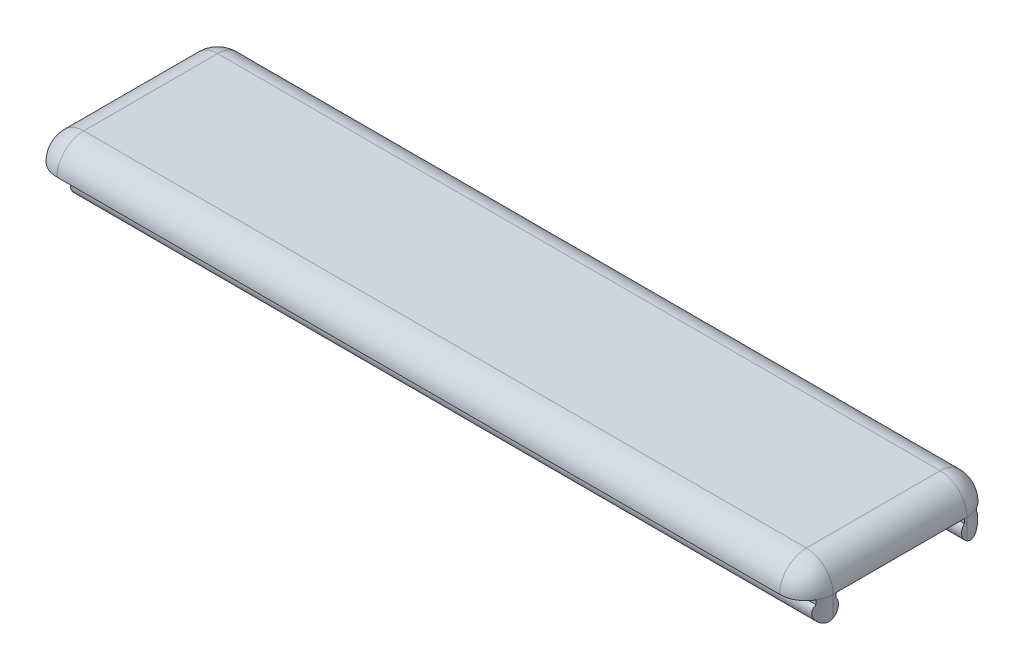
ISO-10303-21;
HEADER;
FILE_DESCRIPTION(('STEP AP214'),'2;1');
FILE_NAME('part.step','',(''),(''),'','','');
FILE_SCHEMA(('AUTOMOTIVE_DESIGN { 1 0 10303 214 1 1 1 1 }'));
ENDSEC;
DATA;
#1=APPLICATION_CONTEXT('core data for automotive mechanical design processes');
#2=APPLICATION_PROTOCOL_DEFINITION('international standard','automotive_design',2000,#1);
#3=PRODUCT_CONTEXT('',#1,'mechanical');
#4=PRODUCT('Part','Part','',(#3));
#5=PRODUCT_RELATED_PRODUCT_CATEGORY('part','',(#4));
#6=PRODUCT_DEFINITION_FORMATION('','',#4);
#7=PRODUCT_DEFINITION_CONTEXT('part definition',#1,'design');
#8=PRODUCT_DEFINITION('design','',#6,#7);
#9=PRODUCT_DEFINITION_SHAPE('','',#8);
#10=(LENGTH_UNIT() NAMED_UNIT(*) SI_UNIT(.MILLI.,.METRE.));
#11=(NAMED_UNIT(*) PLANE_ANGLE_UNIT() SI_UNIT($,.RADIAN.));
#12=(NAMED_UNIT(*) SI_UNIT($,.STERADIAN.) SOLID_ANGLE_UNIT());
#13=UNCERTAINTY_MEASURE_WITH_UNIT(LENGTH_MEASURE(1.E-05),#10,'distance_accuracy_value','');
#14=(GEOMETRIC_REPRESENTATION_CONTEXT(3) GLOBAL_UNCERTAINTY_ASSIGNED_CONTEXT((#13)) GLOBAL_UNIT_ASSIGNED_CONTEXT((#10,
#11,#12)) REPRESENTATION_CONTEXT('',''));
#15=CARTESIAN_POINT('',(0.,0.,0.));
#16=DIRECTION('',(0.,0.,1.));
#17=DIRECTION('',(1.,0.,0.));
#18=AXIS2_PLACEMENT_3D('',#15,#16,#17);
#19=CARTESIAN_POINT('',(72.5,-2.1,12.));
#20=DIRECTION('',(-1.,0.,0.));
#21=DIRECTION('',(0.,0.,1.));
#22=AXIS2_PLACEMENT_3D('',#19,#20,#21);
#23=PLANE('',#22);
#24=DIRECTION('',(0.,1.,0.));
#25=VECTOR('',#24,1.);
#26=CARTESIAN_POINT('',(72.5,-4.1,12.5));
#27=LINE('',#26,#25);
#28=CARTESIAN_POINT('',(72.5,-3.83205080756888,12.5));
#29=VERTEX_POINT('',#28);
#30=CARTESIAN_POINT('',(72.5,0.,12.5));
#31=VERTEX_POINT('',#30);
#32=EDGE_CURVE('E266',#29,#31,#27,.T.);
#33=ORIENTED_EDGE('',*,*,#32,.F.);
#34=CARTESIAN_POINT('',(72.5,-2.1,13.5));
#35=DIRECTION('',(1.,0.,0.));
#36=DIRECTION('',(0.,0.,-1.));
#37=AXIS2_PLACEMENT_3D('',#34,#35,#36);
#38=CIRCLE('',#37,2.);
#39=CARTESIAN_POINT('',(72.5,-0.777124344467708,12.));
#40=VERTEX_POINT('',#39);
#41=EDGE_CURVE('E288',#29,#40,#38,.T.);
#42=ORIENTED_EDGE('',*,*,#41,.T.);
#43=DIRECTION('',(0.,1.,0.));
#44=VECTOR('',#43,1.);
#45=CARTESIAN_POINT('',(72.5,-2.1,12.));
#46=LINE('',#45,#44);
#47=CARTESIAN_POINT('',(72.5,0.,12.));
#48=VERTEX_POINT('',#47);
#49=EDGE_CURVE('E325',#40,#48,#46,.T.);
#50=ORIENTED_EDGE('',*,*,#49,.T.);
#51=DIRECTION('',(0.,0.,-1.));
#52=VECTOR('',#51,1.);
#53=CARTESIAN_POINT('',(72.5,0.,17.5));
#54=LINE('',#53,#52);
#55=EDGE_CURVE('E332',#31,#48,#54,.T.);
#56=ORIENTED_EDGE('',*,*,#55,.F.);
#57=EDGE_LOOP('',(#33,#42,#50,#56));
#58=FACE_BOUND('',#57,.T.);
#59=ADVANCED_FACE('F42',(#58),#23,.F.);
#60=CARTESIAN_POINT('',(72.5,-2.1,15.));
#61=DIRECTION('',(0.,0.,-1.));
#62=DIRECTION('',(-1.,0.,0.));
#63=AXIS2_PLACEMENT_3D('',#60,#61,#62);
#64=PLANE('',#63);
#65=DIRECTION('',(0.,1.,0.));
#66=VECTOR('',#65,1.);
#67=CARTESIAN_POINT('',(71.8301270189222,-4.1,15.));
#68=LINE('',#67,#66);
#69=CARTESIAN_POINT('',(71.8301270189222,0.,15.));
#70=VERTEX_POINT('',#69);
#71=CARTESIAN_POINT('',(71.8301270189222,-0.777124344467697,15.));
#72=VERTEX_POINT('',#71);
#73=EDGE_CURVE('E273',#70,#72,#68,.F.);
#74=ORIENTED_EDGE('',*,*,#73,.F.);
#75=DIRECTION('',(-1.,0.,0.));
#76=VECTOR('',#75,1.);
#77=CARTESIAN_POINT('',(72.5,0.,15.));
#78=LINE('',#77,#76);
#79=CARTESIAN_POINT('',(-67.,0.,15.));
#80=VERTEX_POINT('',#79);
#81=EDGE_CURVE('E315',#70,#80,#78,.T.);
#82=ORIENTED_EDGE('',*,*,#81,.T.);
#83=DIRECTION('',(0.,1.,0.));
#84=VECTOR('',#83,1.);
#85=CARTESIAN_POINT('',(-67.,-2.1,15.));
#86=LINE('',#85,#84);
#87=CARTESIAN_POINT('',(-67.,-0.777124344467697,15.));
#88=VERTEX_POINT('',#87);
#89=EDGE_CURVE('E329',#88,#80,#86,.T.);
#90=ORIENTED_EDGE('',*,*,#89,.F.);
#91=DIRECTION('',(1.,0.,0.));
#92=VECTOR('',#91,1.);
#93=CARTESIAN_POINT('',(-72.6568542494924,-0.777124344467697,15.));
#94=LINE('',#93,#92);
#95=EDGE_CURVE('E293',#88,#72,#94,.T.);
#96=ORIENTED_EDGE('',*,*,#95,.T.);
#97=EDGE_LOOP('',(#74,#82,#90,#96));
#98=FACE_BOUND('',#97,.T.);
#99=ADVANCED_FACE('F447',(#98),#64,.F.);
#100=CARTESIAN_POINT('',(-72.6568542494924,-2.1,13.5));
#101=DIRECTION('',(1.,0.,0.));
#102=DIRECTION('',(0.,0.,-1.));
#103=AXIS2_PLACEMENT_3D('',#100,#101,#102);
#104=CYLINDRICAL_SURFACE('',#103,2.);
#105=ORIENTED_EDGE('',*,*,#41,.F.);
#106=CARTESIAN_POINT('',(72.5,-3.83205080756888,12.5));
#107=CARTESIAN_POINT('',(72.5000051497267,-3.8586377823377,12.5460365078236));
#108=CARTESIAN_POINT('',(72.4993643157109,-3.88337810402291,12.59314069797));
#109=CARTESIAN_POINT('',(72.4966509029909,-3.92902058815213,12.6891353171411));
#110=CARTESIAN_POINT('',(72.4945782697301,-3.94992260430444,12.7380258141632));
#111=CARTESIAN_POINT('',(72.4888670093177,-3.98770486241585,12.8371440450599));
#112=CARTESIAN_POINT('',(72.4852314304111,-4.00459283399911,12.8873689983466));
#113=CARTESIAN_POINT('',(72.4763069192016,-4.03430134702921,12.9888465621957));
#114=CARTESIAN_POINT('',(72.4710180795205,-4.04712211625498,13.0400991150375));
#115=CARTESIAN_POINT('',(72.4525581692937,-4.0793981669255,13.1949242412481));
#116=CARTESIAN_POINT('',(72.436793915347,-4.09266572632393,13.2995604139902));
#117=CARTESIAN_POINT('',(72.3984353701033,-4.10271565022982,13.508273897506));
#118=CARTESIAN_POINT('',(72.3758416716876,-4.0994994453478,13.6123512559939));
#119=CARTESIAN_POINT('',(72.3242896848976,-4.07726417748559,13.818173896726));
#120=CARTESIAN_POINT('',(72.2952758201275,-4.05810281846783,13.9198896716079));
#121=CARTESIAN_POINT('',(72.2322037555696,-4.00497180398602,14.1177299482178));
#122=CARTESIAN_POINT('',(72.1981430907153,-3.97099489614719,14.2138516854497));
#123=CARTESIAN_POINT('',(72.1234426411648,-3.88605501582515,14.4066607553379));
#124=CARTESIAN_POINT('',(72.0824894357773,-3.83388961756837,14.5026959043862));
#125=CARTESIAN_POINT('',(71.9986519075302,-3.71514562217958,14.6845313329512));
#126=CARTESIAN_POINT('',(71.9557659765214,-3.64855484008303,14.7703228641782));
#127=CARTESIAN_POINT('',(71.8664305182792,-3.49503878727911,14.9380660052748));
#128=CARTESIAN_POINT('',(71.8200432291564,-3.40676088603826,15.0188190933193));
#129=CARTESIAN_POINT('',(71.7319440814113,-3.21573705486275,15.1641832270633));
#130=CARTESIAN_POINT('',(71.6902282998661,-3.11300343031669,15.228807873603));
#131=CARTESIAN_POINT('',(71.6241294877134,-2.91837578204629,15.3274184972095));
#132=CARTESIAN_POINT('',(71.597948594273,-2.82891956043812,15.3650061522905));
#133=CARTESIAN_POINT('',(71.5537936372805,-2.6436899489622,15.4271522161069));
#134=CARTESIAN_POINT('',(71.5358098971438,-2.54792416114056,15.4517259930578));
#135=CARTESIAN_POINT('',(71.5100775529531,-2.3517915082896,15.4865982987532));
#136=CARTESIAN_POINT('',(71.5023940258154,-2.25139949578742,15.4968060829075));
#137=CARTESIAN_POINT('',(71.4985701409913,-2.05001313679733,15.5019081458503));
#138=CARTESIAN_POINT('',(71.5024264691326,-1.94901897155801,15.4968068213153));
#139=CARTESIAN_POINT('',(71.5201752285011,-1.75985096216501,15.4729393311563));
#140=CARTESIAN_POINT('',(71.5330407101488,-1.6713948290502,15.4555699761503));
#141=CARTESIAN_POINT('',(71.5663112117035,-1.49890773185101,15.4096238344383));
#142=CARTESIAN_POINT('',(71.5867217598434,-1.41488006418928,15.3810388291358));
#143=CARTESIAN_POINT('',(71.635114913323,-1.24644143536097,15.311184883511));
#144=CARTESIAN_POINT('',(71.6635614043424,-1.16250443480382,15.2691052968919));
#145=CARTESIAN_POINT('',(71.7248810512641,-1.0025933857869,15.1746097210026));
#146=CARTESIAN_POINT('',(71.7577498350435,-0.926611602640642,15.1222039173272));
#147=CARTESIAN_POINT('',(71.8044433102529,-0.828409103959493,15.0440875491672));
#148=CARTESIAN_POINT('',(71.8172284161431,-0.802460594960075,15.022344328525));
#149=CARTESIAN_POINT('',(71.8301270189222,-0.777124344467696,15.));
#150=B_SPLINE_CURVE_WITH_KNOTS('',3,(#106,#107,#108,#109,#110,#111,#112,#113,#114,#115,#116,
#117,#118,#119,#120,#121,#122,#123,#124,#125,#126,#127,#128,#129,#130,#131,#132,#133,#134,#135,
#136,#137,#138,#139,#140,#141,#142,#143,#144,#145,#146,#147,#148,#149),.UNSPECIFIED.,.F.,.F.,(4,
2,2,2,2,2,2,2,2,2,2,2,2,2,2,2,2,2,2,2,2,4),(0.,0.159441493493553,0.318889062618392,
0.478027058700238,0.637156140869807,0.955426570056517,1.27366937731754,1.59478305667,
1.91605410148729,2.26475063051828,2.61374285625625,2.99690704003933,3.37974700782848,
3.68005336106362,3.9800042843142,4.28184150892179,4.58359205613913,4.85559282929881,
5.12779329236686,5.42106720097359,5.71405326465856,5.8225663026188),.UNSPECIFIED.);
#151=EDGE_CURVE('E11',#29,#72,#150,.T.);
#152=ORIENTED_EDGE('',*,*,#151,.T.);
#153=ORIENTED_EDGE('',*,*,#95,.F.);
#154=CARTESIAN_POINT('',(-67.,-2.1,13.5));
#155=DIRECTION('',(1.,0.,0.));
#156=DIRECTION('',(0.,0.,-1.));
#157=AXIS2_PLACEMENT_3D('',#154,#155,#156);
#158=CIRCLE('',#157,2.);
#159=CARTESIAN_POINT('',(-67.,-0.777124344467708,12.));
#160=VERTEX_POINT('',#159);
#161=EDGE_CURVE('E290',#160,#88,#158,.F.);
#162=ORIENTED_EDGE('',*,*,#161,.F.);
#163=DIRECTION('',(1.,0.,0.));
#164=VECTOR('',#163,1.);
#165=CARTESIAN_POINT('',(-72.6568542494924,-0.777124344467708,12.));
#166=LINE('',#165,#164);
#167=EDGE_CURVE('E318',#40,#160,#166,.F.);
#168=ORIENTED_EDGE('',*,*,#167,.F.);
#169=EDGE_LOOP('',(#105,#152,#153,#162,#168));
#170=FACE_BOUND('',#169,.T.);
#171=ADVANCED_FACE('F453',(#170),#104,.T.);
#172=CARTESIAN_POINT('',(72.5,-2.1,-15.));
#173=DIRECTION('',(0.,0.,1.));
#174=DIRECTION('',(1.,0.,0.));
#175=AXIS2_PLACEMENT_3D('',#172,#173,#174);
#176=PLANE('',#175);
#177=DIRECTION('',(0.,1.,0.));
#178=VECTOR('',#177,1.);
#179=CARTESIAN_POINT('',(71.8301270189222,-4.1,-15.));
#180=LINE('',#179,#178);
#181=CARTESIAN_POINT('',(71.8301270189222,-0.777124344467713,-15.));
#182=VERTEX_POINT('',#181);
#183=CARTESIAN_POINT('',(71.8301270189222,0.,-15.));
#184=VERTEX_POINT('',#183);
#185=EDGE_CURVE('E278',#182,#184,#180,.T.);
#186=ORIENTED_EDGE('',*,*,#185,.F.);
#187=DIRECTION('',(1.,0.,0.));
#188=VECTOR('',#187,1.);
#189=CARTESIAN_POINT('',(-72.6568542494924,-0.777124344467713,-15.));
#190=LINE('',#189,#188);
#191=CARTESIAN_POINT('',(-67.,-0.777124344467713,-15.));
#192=VERTEX_POINT('',#191);
#193=EDGE_CURVE('E388',#182,#192,#190,.F.);
#194=ORIENTED_EDGE('',*,*,#193,.T.);
#195=DIRECTION('',(0.,1.,0.));
#196=VECTOR('',#195,1.);
#197=CARTESIAN_POINT('',(-67.,-2.1,-15.));
#198=LINE('',#197,#196);
#199=CARTESIAN_POINT('',(-67.,0.,-15.));
#200=VERTEX_POINT('',#199);
#201=EDGE_CURVE('E308',#192,#200,#198,.T.);
#202=ORIENTED_EDGE('',*,*,#201,.T.);
#203=DIRECTION('',(1.,0.,0.));
#204=VECTOR('',#203,1.);
#205=CARTESIAN_POINT('',(72.5,0.,-15.));
#206=LINE('',#205,#204);
#207=EDGE_CURVE('E305',#200,#184,#206,.T.);
#208=ORIENTED_EDGE('',*,*,#207,.T.);
#209=EDGE_LOOP('',(#186,#194,#202,#208));
#210=FACE_BOUND('',#209,.T.);
#211=ADVANCED_FACE('F503',(#210),#176,.F.);
#212=CARTESIAN_POINT('',(-72.6568542494924,-2.1,-13.5));
#213=DIRECTION('',(1.,0.,0.));
#214=DIRECTION('',(0.,0.,-1.));
#215=AXIS2_PLACEMENT_3D('',#212,#213,#214);
#216=CYLINDRICAL_SURFACE('',#215,2.);
#217=ORIENTED_EDGE('',*,*,#193,.F.);
#218=CARTESIAN_POINT('',(71.8301270189222,-0.777124344467713,-15.));
#219=CARTESIAN_POINT('',(71.7903887656085,-0.855232548240955,-15.0688885369105));
#220=CARTESIAN_POINT('',(71.7516615980636,-0.93922114525095,-15.132099022754));
#221=CARTESIAN_POINT('',(71.679092052389,-1.11848426219626,-15.2458552449527));
#222=CARTESIAN_POINT('',(71.6452992512872,-1.21385786003245,-15.2962757598494));
#223=CARTESIAN_POINT('',(71.5861729997275,-1.41443748585583,-15.382004350938));
#224=CARTESIAN_POINT('',(71.5608867014549,-1.51969431256576,-15.4172284868965));
#225=CARTESIAN_POINT('',(71.522616060364,-1.73632978955962,-15.4697896679562));
#226=CARTESIAN_POINT('',(71.5095742618047,-1.84767722710235,-15.4872102882304));
#227=CARTESIAN_POINT('',(71.498556921324,-2.05744246969237,-15.5019332580329));
#228=CARTESIAN_POINT('',(71.4988046186273,-2.15560503283809,-15.5016080510088));
#229=CARTESIAN_POINT('',(71.5099676363751,-2.35029737908092,-15.4866777607306));
#230=CARTESIAN_POINT('',(71.5208926784616,-2.44682559262955,-15.4720596639026));
#231=CARTESIAN_POINT('',(71.5509588421055,-2.62882102202493,-15.4309242518983));
#232=CARTESIAN_POINT('',(71.5694908138221,-2.71459405223836,-15.4052835903944));
#233=CARTESIAN_POINT('',(71.612875839932,-2.88053488975168,-15.3435315873049));
#234=CARTESIAN_POINT('',(71.6377295659807,-2.96070210030612,-15.3074191330856));
#235=CARTESIAN_POINT('',(71.6956562481701,-3.12502084936273,-15.220213604462));
#236=CARTESIAN_POINT('',(71.7293893744356,-3.20820565631949,-15.1677437493387));
#237=CARTESIAN_POINT('',(71.8001864095033,-3.36516170014842,-15.0520586373715));
#238=CARTESIAN_POINT('',(71.8372527752876,-3.43892589439437,-14.9888354229514));
#239=CARTESIAN_POINT('',(71.919337897746,-3.58866353817369,-14.8404823894347));
#240=CARTESIAN_POINT('',(71.9645871690909,-3.66264484983667,-14.7534578081731));
#241=CARTESIAN_POINT('',(72.0536557986934,-3.79508798452008,-14.5675714434908));
#242=CARTESIAN_POINT('',(72.0974742618177,-3.85354024954858,-14.4687024239829));
#243=CARTESIAN_POINT('',(72.1831645748203,-3.95576974323272,-14.2555121906804));
#244=CARTESIAN_POINT('',(72.2248163791233,-3.99862474128537,-14.1406545374361));
#245=CARTESIAN_POINT('',(72.3007937451913,-4.06287185420124,-13.9028223970878));
#246=CARTESIAN_POINT('',(72.3351266985739,-4.08428570499448,-13.7798562650453));
#247=CARTESIAN_POINT('',(72.3918419924295,-4.1028431829185,-13.5409639055485));
#248=CARTESIAN_POINT('',(72.4150138994325,-4.10196994253518,-13.4253798620884));
#249=CARTESIAN_POINT('',(72.4528752812184,-4.07994984528907,-13.1947322168079));
#250=CARTESIAN_POINT('',(72.4675692747094,-4.05881380447121,-13.0796683702332));
#251=CARTESIAN_POINT('',(72.4857753929797,-4.00519098653087,-12.8856790770473));
#252=CARTESIAN_POINT('',(72.4912581481445,-3.97747548731091,-12.805578469221));
#253=CARTESIAN_POINT('',(72.4983853831719,-3.91209967409706,-12.6494182651707));
#254=CARTESIAN_POINT('',(72.500032139118,-3.87444527210937,-12.5733562988226));
#255=CARTESIAN_POINT('',(72.5,-3.83205080756888,-12.5));
#256=B_SPLINE_CURVE_WITH_KNOTS('',3,(#218,#219,#220,#221,#222,#223,#224,#225,#226,#227,#228,
#229,#230,#231,#232,#233,#234,#235,#236,#237,#238,#239,#240,#241,#242,#243,#244,#245,#246,#247,
#248,#249,#250,#251,#252,#253,#254,#255),.UNSPECIFIED.,.F.,.F.,(4,2,2,2,2,2,2,2,2,2,2,2,2,2,2,2,
2,2,4),(0.,0.334507423064719,0.672173400216167,1.01168137794935,1.34958817687069,
1.64244712879718,1.93557297524073,2.20876810587288,2.4819922742829,2.79276835309208,
3.10377541743615,3.47076175958286,3.83797345803227,4.22429916105857,4.61023282927275,
4.96195602614956,5.31349158178893,5.56756984235079,5.8214973075652),.UNSPECIFIED.);
#257=CARTESIAN_POINT('',(72.5,-3.83205080756888,-12.5));
#258=VERTEX_POINT('',#257);
#259=EDGE_CURVE('E56',#182,#258,#256,.T.);
#260=ORIENTED_EDGE('',*,*,#259,.T.);
#261=CARTESIAN_POINT('',(72.5,-2.1,-13.5));
#262=DIRECTION('',(1.,0.,0.));
#263=DIRECTION('',(0.,0.,-1.));
#264=AXIS2_PLACEMENT_3D('',#261,#262,#263);
#265=CIRCLE('',#264,2.);
#266=CARTESIAN_POINT('',(72.5,-0.777124344467706,-12.));
#267=VERTEX_POINT('',#266);
#268=EDGE_CURVE('E280',#267,#258,#265,.T.);
#269=ORIENTED_EDGE('',*,*,#268,.F.);
#270=DIRECTION('',(1.,0.,0.));
#271=VECTOR('',#270,1.);
#272=CARTESIAN_POINT('',(-72.6568542494924,-0.777124344467706,-12.));
#273=LINE('',#272,#271);
#274=CARTESIAN_POINT('',(-67.,-0.777124344467706,-12.));
#275=VERTEX_POINT('',#274);
#276=EDGE_CURVE('E286',#275,#267,#273,.T.);
#277=ORIENTED_EDGE('',*,*,#276,.F.);
#278=CARTESIAN_POINT('',(-67.,-2.1,-13.5));
#279=DIRECTION('',(1.,0.,0.));
#280=DIRECTION('',(0.,0.,-1.));
#281=AXIS2_PLACEMENT_3D('',#278,#279,#280);
#282=CIRCLE('',#281,2.);
#283=EDGE_CURVE('E283',#192,#275,#282,.F.);
#284=ORIENTED_EDGE('',*,*,#283,.F.);
#285=EDGE_LOOP('',(#217,#260,#269,#277,#284));
#286=FACE_BOUND('',#285,.T.);
#287=ADVANCED_FACE('F396',(#286),#216,.T.);
#288=CARTESIAN_POINT('',(0.,0.,0.));
#289=DIRECTION('',(0.,-1.,0.));
#290=DIRECTION('',(0.,0.,-1.));
#291=AXIS2_PLACEMENT_3D('',#288,#289,#290);
#292=PLANE('',#291);
#293=DIRECTION('',(0.,0.,-1.));
#294=VECTOR('',#293,1.);
#295=CARTESIAN_POINT('',(60.5,0.,7.5));
#296=LINE('',#295,#294);
#297=CARTESIAN_POINT('',(60.5,0.,7.5));
#298=VERTEX_POINT('',#297);
#299=CARTESIAN_POINT('',(60.5,0.,-7.5));
#300=VERTEX_POINT('',#299);
#301=EDGE_CURVE('E63',#298,#300,#296,.T.);
#302=ORIENTED_EDGE('',*,*,#301,.F.);
#303=DIRECTION('',(-1.,0.,0.));
#304=VECTOR('',#303,1.);
#305=CARTESIAN_POINT('',(60.5,0.,7.5));
#306=LINE('',#305,#304);
#307=CARTESIAN_POINT('',(62.5,0.,7.5));
#308=VERTEX_POINT('',#307);
#309=EDGE_CURVE('E223',#308,#298,#306,.T.);
#310=ORIENTED_EDGE('',*,*,#309,.F.);
#311=DIRECTION('',(0.,0.,1.));
#312=VECTOR('',#311,1.);
#313=CARTESIAN_POINT('',(62.5,0.,7.5));
#314=LINE('',#313,#312);
#315=CARTESIAN_POINT('',(62.5,0.,-7.5));
#316=VERTEX_POINT('',#315);
#317=EDGE_CURVE('E226',#316,#308,#314,.T.);
#318=ORIENTED_EDGE('',*,*,#317,.F.);
#319=DIRECTION('',(1.,0.,0.));
#320=VECTOR('',#319,1.);
#321=CARTESIAN_POINT('',(60.5,0.,-7.5));
#322=LINE('',#321,#320);
#323=EDGE_CURVE('E232',#300,#316,#322,.T.);
#324=ORIENTED_EDGE('',*,*,#323,.F.);
#325=EDGE_LOOP('',(#302,#310,#318,#324));
#326=FACE_BOUND('',#325,.T.);
#327=DIRECTION('',(0.,0.,-1.));
#328=VECTOR('',#327,1.);
#329=CARTESIAN_POINT('',(-67.5,0.,7.5));
#330=LINE('',#329,#328);
#331=CARTESIAN_POINT('',(-67.5,0.,7.5));
#332=VERTEX_POINT('',#331);
#333=CARTESIAN_POINT('',(-67.5,0.,-7.5));
#334=VERTEX_POINT('',#333);
#335=EDGE_CURVE('E71',#332,#334,#330,.T.);
#336=ORIENTED_EDGE('',*,*,#335,.F.);
#337=DIRECTION('',(-1.,0.,0.));
#338=VECTOR('',#337,1.);
#339=CARTESIAN_POINT('',(-67.5,0.,7.5));
#340=LINE('',#339,#338);
#341=CARTESIAN_POINT('',(-65.5,0.,7.5));
#342=VERTEX_POINT('',#341);
#343=EDGE_CURVE('E245',#342,#332,#340,.T.);
#344=ORIENTED_EDGE('',*,*,#343,.F.);
#345=DIRECTION('',(0.,0.,1.));
#346=VECTOR('',#345,1.);
#347=CARTESIAN_POINT('',(-65.5,0.,7.5));
#348=LINE('',#347,#346);
#349=CARTESIAN_POINT('',(-65.5,0.,-7.5));
#350=VERTEX_POINT('',#349);
#351=EDGE_CURVE('E259',#350,#342,#348,.T.);
#352=ORIENTED_EDGE('',*,*,#351,.F.);
#353=DIRECTION('',(1.,0.,0.));
#354=VECTOR('',#353,1.);
#355=CARTESIAN_POINT('',(-67.5,0.,-7.5));
#356=LINE('',#355,#354);
#357=EDGE_CURVE('E256',#334,#350,#356,.T.);
#358=ORIENTED_EDGE('',*,*,#357,.F.);
#359=EDGE_LOOP('',(#336,#344,#352,#358));
#360=FACE_BOUND('',#359,.T.);
#361=DIRECTION('',(0.,0.,-1.));
#362=VECTOR('',#361,1.);
#363=CARTESIAN_POINT('',(-67.,0.,-12.));
#364=LINE('',#363,#362);
#365=CARTESIAN_POINT('',(-67.,0.,-12.));
#366=VERTEX_POINT('',#365);
#367=EDGE_CURVE('E302',#366,#200,#364,.T.);
#368=ORIENTED_EDGE('',*,*,#367,.F.);
#369=DIRECTION('',(-1.,0.,0.));
#370=VECTOR('',#369,1.);
#371=CARTESIAN_POINT('',(72.5,0.,-12.));
#372=LINE('',#371,#370);
#373=CARTESIAN_POINT('',(72.5,0.,-12.));
#374=VERTEX_POINT('',#373);
#375=EDGE_CURVE('E299',#374,#366,#372,.T.);
#376=ORIENTED_EDGE('',*,*,#375,.F.);
#377=EDGE_CURVE('E331',#48,#374,#54,.T.);
#378=ORIENTED_EDGE('',*,*,#377,.F.);
#379=DIRECTION('',(1.,0.,0.));
#380=VECTOR('',#379,1.);
#381=CARTESIAN_POINT('',(72.5,0.,12.));
#382=LINE('',#381,#380);
#383=CARTESIAN_POINT('',(-67.,0.,12.));
#384=VERTEX_POINT('',#383);
#385=EDGE_CURVE('E322',#384,#48,#382,.T.);
#386=ORIENTED_EDGE('',*,*,#385,.F.);
#387=DIRECTION('',(0.,0.,-1.));
#388=VECTOR('',#387,1.);
#389=CARTESIAN_POINT('',(-67.,0.,12.));
#390=LINE('',#389,#388);
#391=EDGE_CURVE('E314',#80,#384,#390,.T.);
#392=ORIENTED_EDGE('',*,*,#391,.F.);
#393=ORIENTED_EDGE('',*,*,#81,.F.);
#394=CARTESIAN_POINT('',(67.5,0.,12.5));
#395=DIRECTION('',(0.,-1.,0.));
#396=DIRECTION('',(0.,0.,-1.));
#397=AXIS2_PLACEMENT_3D('',#394,#395,#396);
#398=CIRCLE('',#397,5.);
#399=CARTESIAN_POINT('',(67.5,0.,17.5));
#400=VERTEX_POINT('',#399);
#401=EDGE_CURVE('E361',#70,#400,#398,.T.);
#402=ORIENTED_EDGE('',*,*,#401,.T.);
#403=DIRECTION('',(1.,0.,0.));
#404=VECTOR('',#403,1.);
#405=CARTESIAN_POINT('',(-72.5,0.,17.5));
#406=LINE('',#405,#404);
#407=CARTESIAN_POINT('',(-67.5,0.,17.5));
#408=VERTEX_POINT('',#407);
#409=EDGE_CURVE('E341',#408,#400,#406,.T.);
#410=ORIENTED_EDGE('',*,*,#409,.F.);
#411=CARTESIAN_POINT('',(-67.5,0.,12.5));
#412=DIRECTION('',(0.,-1.,0.));
#413=DIRECTION('',(0.,0.,-1.));
#414=AXIS2_PLACEMENT_3D('',#411,#412,#413);
#415=CIRCLE('',#414,5.);
#416=CARTESIAN_POINT('',(-72.5,0.,12.5));
#417=VERTEX_POINT('',#416);
#418=EDGE_CURVE('E368',#408,#417,#415,.T.);
#419=ORIENTED_EDGE('',*,*,#418,.T.);
#420=DIRECTION('',(0.,0.,1.));
#421=VECTOR('',#420,1.);
#422=CARTESIAN_POINT('',(-72.5,0.,17.5));
#423=LINE('',#422,#421);
#424=CARTESIAN_POINT('',(-72.5,0.,-12.5));
#425=VERTEX_POINT('',#424);
#426=EDGE_CURVE('E338',#425,#417,#423,.T.);
#427=ORIENTED_EDGE('',*,*,#426,.F.);
#428=CARTESIAN_POINT('',(-67.5,0.,-12.5));
#429=DIRECTION('',(0.,-1.,0.));
#430=DIRECTION('',(0.,0.,-1.));
#431=AXIS2_PLACEMENT_3D('',#428,#429,#430);
#432=CIRCLE('',#431,5.);
#433=CARTESIAN_POINT('',(-67.5,0.,-17.5));
#434=VERTEX_POINT('',#433);
#435=EDGE_CURVE('E370',#425,#434,#432,.T.);
#436=ORIENTED_EDGE('',*,*,#435,.T.);
#437=DIRECTION('',(-1.,0.,0.));
#438=VECTOR('',#437,1.);
#439=CARTESIAN_POINT('',(-72.5,0.,-17.5));
#440=LINE('',#439,#438);
#441=CARTESIAN_POINT('',(67.5,0.,-17.5));
#442=VERTEX_POINT('',#441);
#443=EDGE_CURVE('E335',#442,#434,#440,.T.);
#444=ORIENTED_EDGE('',*,*,#443,.F.);
#445=CARTESIAN_POINT('',(67.5,0.,-12.5));
#446=DIRECTION('',(0.,-1.,0.));
#447=DIRECTION('',(0.,0.,-1.));
#448=AXIS2_PLACEMENT_3D('',#445,#446,#447);
#449=CIRCLE('',#448,5.);
#450=EDGE_CURVE('E365',#442,#184,#449,.T.);
#451=ORIENTED_EDGE('',*,*,#450,.T.);
#452=ORIENTED_EDGE('',*,*,#207,.F.);
#453=EDGE_LOOP('',(#368,#376,#378,#386,#392,#393,#402,#410,#419,#427,#436,#444,#451,#452));
#454=FACE_BOUND('',#453,.T.);
#455=ADVANCED_FACE('F459',(#326,#360,#454),#292,.T.);
#456=CARTESIAN_POINT('',(0.,0.,-12.5));
#457=DIRECTION('',(-1.,0.,0.));
#458=DIRECTION('',(0.,0.,1.));
#459=AXIS2_PLACEMENT_3D('',#456,#457,#458);
#460=CYLINDRICAL_SURFACE('',#459,5.);
#461=ORIENTED_EDGE('',*,*,#443,.T.);
#462=CARTESIAN_POINT('',(-67.5,0.,-12.5));
#463=DIRECTION('',(-1.,0.,0.));
#464=DIRECTION('',(0.,0.,1.));
#465=AXIS2_PLACEMENT_3D('',#462,#463,#464);
#466=CIRCLE('',#465,5.);
#467=CARTESIAN_POINT('',(-67.5,5.,-12.5));
#468=VERTEX_POINT('',#467);
#469=EDGE_CURVE('E374',#434,#468,#466,.F.);
#470=ORIENTED_EDGE('',*,*,#469,.T.);
#471=DIRECTION('',(-1.,0.,0.));
#472=VECTOR('',#471,1.);
#473=CARTESIAN_POINT('',(0.,5.,-12.5));
#474=LINE('',#473,#472);
#475=CARTESIAN_POINT('',(67.5,5.,-12.5));
#476=VERTEX_POINT('',#475);
#477=EDGE_CURVE('E347',#476,#468,#474,.T.);
#478=ORIENTED_EDGE('',*,*,#477,.F.);
#479=CARTESIAN_POINT('',(67.5,0.,-12.5));
#480=DIRECTION('',(-1.,0.,0.));
#481=DIRECTION('',(0.,0.,1.));
#482=AXIS2_PLACEMENT_3D('',#479,#480,#481);
#483=CIRCLE('',#482,5.);
#484=EDGE_CURVE('E372',#476,#442,#483,.T.);
#485=ORIENTED_EDGE('',*,*,#484,.T.);
#486=EDGE_LOOP('',(#461,#470,#478,#485));
#487=FACE_BOUND('',#486,.T.);
#488=ADVANCED_FACE('F462',(#487),#460,.T.);
#489=CARTESIAN_POINT('',(-67.5,0.,0.));
#490=DIRECTION('',(0.,0.,1.));
#491=DIRECTION('',(1.,0.,0.));
#492=AXIS2_PLACEMENT_3D('',#489,#490,#491);
#493=CYLINDRICAL_SURFACE('',#492,5.);
#494=DIRECTION('',(0.,0.,1.));
#495=VECTOR('',#494,1.);
#496=CARTESIAN_POINT('',(-67.5,5.,0.));
#497=LINE('',#496,#495);
#498=CARTESIAN_POINT('',(-67.5,5.,12.5));
#499=VERTEX_POINT('',#498);
#500=EDGE_CURVE('E350',#468,#499,#497,.T.);
#501=ORIENTED_EDGE('',*,*,#500,.F.);
#502=CARTESIAN_POINT('',(-67.5,0.,-12.5));
#503=DIRECTION('',(0.,0.,1.));
#504=DIRECTION('',(1.,0.,0.));
#505=AXIS2_PLACEMENT_3D('',#502,#503,#504);
#506=CIRCLE('',#505,5.);
#507=EDGE_CURVE('E358',#468,#425,#506,.T.);
#508=ORIENTED_EDGE('',*,*,#507,.T.);
#509=ORIENTED_EDGE('',*,*,#426,.T.);
#510=CARTESIAN_POINT('',(-67.5,0.,12.5));
#511=DIRECTION('',(0.,0.,1.));
#512=DIRECTION('',(1.,0.,0.));
#513=AXIS2_PLACEMENT_3D('',#510,#511,#512);
#514=CIRCLE('',#513,5.);
#515=EDGE_CURVE('E356',#417,#499,#514,.F.);
#516=ORIENTED_EDGE('',*,*,#515,.T.);
#517=EDGE_LOOP('',(#501,#508,#509,#516));
#518=FACE_BOUND('',#517,.T.);
#519=ADVANCED_FACE('F472',(#518),#493,.T.);
#520=CARTESIAN_POINT('',(67.5,0.,0.));
#521=DIRECTION('',(0.,0.,-1.));
#522=DIRECTION('',(-1.,0.,0.));
#523=AXIS2_PLACEMENT_3D('',#520,#521,#522);
#524=CYLINDRICAL_SURFACE('',#523,5.);
#525=ORIENTED_EDGE('',*,*,#55,.T.);
#526=ORIENTED_EDGE('',*,*,#377,.T.);
#527=DIRECTION('',(0.,0.,1.));
#528=VECTOR('',#527,1.);
#529=CARTESIAN_POINT('',(72.5,0.,-12.));
#530=LINE('',#529,#528);
#531=CARTESIAN_POINT('',(72.5,0.,-12.5));
#532=VERTEX_POINT('',#531);
#533=EDGE_CURVE('E296',#532,#374,#530,.T.);
#534=ORIENTED_EDGE('',*,*,#533,.F.);
#535=CARTESIAN_POINT('',(67.5,0.,-12.5));
#536=DIRECTION('',(0.,0.,-1.));
#537=DIRECTION('',(-1.,0.,0.));
#538=AXIS2_PLACEMENT_3D('',#535,#536,#537);
#539=CIRCLE('',#538,5.);
#540=EDGE_CURVE('E319',#532,#476,#539,.F.);
#541=ORIENTED_EDGE('',*,*,#540,.T.);
#542=DIRECTION('',(0.,0.,-1.));
#543=VECTOR('',#542,1.);
#544=CARTESIAN_POINT('',(67.5,5.,0.));
#545=LINE('',#544,#543);
#546=CARTESIAN_POINT('',(67.5,5.,12.5));
#547=VERTEX_POINT('',#546);
#548=EDGE_CURVE('E344',#547,#476,#545,.T.);
#549=ORIENTED_EDGE('',*,*,#548,.F.);
#550=CARTESIAN_POINT('',(67.5,0.,12.5));
#551=DIRECTION('',(0.,0.,-1.));
#552=DIRECTION('',(-1.,0.,0.));
#553=AXIS2_PLACEMENT_3D('',#550,#551,#552);
#554=CIRCLE('',#553,5.);
#555=EDGE_CURVE('E382',#547,#31,#554,.T.);
#556=ORIENTED_EDGE('',*,*,#555,.T.);
#557=EDGE_LOOP('',(#525,#526,#534,#541,#549,#556));
#558=FACE_BOUND('',#557,.T.);
#559=ADVANCED_FACE('F468',(#558),#524,.T.);
#560=CARTESIAN_POINT('',(0.,0.,12.5));
#561=DIRECTION('',(1.,0.,0.));
#562=DIRECTION('',(0.,0.,-1.));
#563=AXIS2_PLACEMENT_3D('',#560,#561,#562);
#564=CYLINDRICAL_SURFACE('',#563,5.);
#565=DIRECTION('',(1.,0.,0.));
#566=VECTOR('',#565,1.);
#567=CARTESIAN_POINT('',(0.,5.,12.5));
#568=LINE('',#567,#566);
#569=EDGE_CURVE('E353',#499,#547,#568,.T.);
#570=ORIENTED_EDGE('',*,*,#569,.F.);
#571=CARTESIAN_POINT('',(-67.5,0.,12.5));
#572=DIRECTION('',(1.,0.,0.));
#573=DIRECTION('',(0.,0.,-1.));
#574=AXIS2_PLACEMENT_3D('',#571,#572,#573);
#575=CIRCLE('',#574,5.);
#576=EDGE_CURVE('E379',#499,#408,#575,.T.);
#577=ORIENTED_EDGE('',*,*,#576,.T.);
#578=ORIENTED_EDGE('',*,*,#409,.T.);
#579=CARTESIAN_POINT('',(67.5,0.,12.5));
#580=DIRECTION('',(1.,0.,0.));
#581=DIRECTION('',(0.,0.,-1.));
#582=AXIS2_PLACEMENT_3D('',#579,#580,#581);
#583=CIRCLE('',#582,5.);
#584=EDGE_CURVE('E376',#400,#547,#583,.F.);
#585=ORIENTED_EDGE('',*,*,#584,.T.);
#586=EDGE_LOOP('',(#570,#577,#578,#585));
#587=FACE_BOUND('',#586,.T.);
#588=ADVANCED_FACE('F464',(#587),#564,.T.);
#589=CARTESIAN_POINT('',(-67.5,0.,-12.5));
#590=DIRECTION('',(0.,0.,1.));
#591=DIRECTION('',(1.,0.,0.));
#592=AXIS2_PLACEMENT_3D('',#589,#590,#591);
#593=SPHERICAL_SURFACE('',#592,5.);
#594=ORIENTED_EDGE('',*,*,#507,.F.);
#595=ORIENTED_EDGE('',*,*,#469,.F.);
#596=ORIENTED_EDGE('',*,*,#435,.F.);
#597=EDGE_LOOP('',(#594,#595,#596));
#598=FACE_BOUND('',#597,.T.);
#599=ADVANCED_FACE('F467',(#598),#593,.T.);
#600=CARTESIAN_POINT('',(-67.5,0.,12.5));
#601=DIRECTION('',(0.,0.,1.));
#602=DIRECTION('',(1.,0.,0.));
#603=AXIS2_PLACEMENT_3D('',#600,#601,#602);
#604=SPHERICAL_SURFACE('',#603,5.);
#605=ORIENTED_EDGE('',*,*,#576,.F.);
#606=ORIENTED_EDGE('',*,*,#515,.F.);
#607=ORIENTED_EDGE('',*,*,#418,.F.);
#608=EDGE_LOOP('',(#605,#606,#607));
#609=FACE_BOUND('',#608,.T.);
#610=ADVANCED_FACE('F482',(#609),#604,.T.);
#611=CARTESIAN_POINT('',(67.5,0.,-12.5));
#612=DIRECTION('',(0.,0.,1.));
#613=DIRECTION('',(1.,0.,0.));
#614=AXIS2_PLACEMENT_3D('',#611,#612,#613);
#615=SPHERICAL_SURFACE('',#614,5.);
#616=ORIENTED_EDGE('',*,*,#450,.F.);
#617=ORIENTED_EDGE('',*,*,#484,.F.);
#618=ORIENTED_EDGE('',*,*,#540,.F.);
#619=EDGE_CURVE('E364',#184,#532,#449,.T.);
#620=ORIENTED_EDGE('',*,*,#619,.F.);
#621=EDGE_LOOP('',(#616,#617,#618,#620));
#622=FACE_BOUND('',#621,.T.);
#623=ADVANCED_FACE('F485',(#622),#615,.T.);
#624=CARTESIAN_POINT('',(67.5,0.,12.5));
#625=DIRECTION('',(0.,0.,1.));
#626=DIRECTION('',(1.,0.,0.));
#627=AXIS2_PLACEMENT_3D('',#624,#625,#626);
#628=SPHERICAL_SURFACE('',#627,5.);
#629=EDGE_CURVE('E362',#31,#70,#398,.T.);
#630=ORIENTED_EDGE('',*,*,#629,.F.);
#631=ORIENTED_EDGE('',*,*,#555,.F.);
#632=ORIENTED_EDGE('',*,*,#584,.F.);
#633=ORIENTED_EDGE('',*,*,#401,.F.);
#634=EDGE_LOOP('',(#630,#631,#632,#633));
#635=FACE_BOUND('',#634,.T.);
#636=ADVANCED_FACE('F44',(#635),#628,.T.);
#637=CARTESIAN_POINT('',(-67.,-2.1,12.));
#638=DIRECTION('',(1.,0.,0.));
#639=DIRECTION('',(0.,0.,-1.));
#640=AXIS2_PLACEMENT_3D('',#637,#638,#639);
#641=PLANE('',#640);
#642=ORIENTED_EDGE('',*,*,#161,.T.);
#643=ORIENTED_EDGE('',*,*,#89,.T.);
#644=ORIENTED_EDGE('',*,*,#391,.T.);
#645=DIRECTION('',(0.,1.,0.));
#646=VECTOR('',#645,1.);
#647=CARTESIAN_POINT('',(-67.,-2.1,12.));
#648=LINE('',#647,#646);
#649=EDGE_CURVE('E327',#160,#384,#648,.T.);
#650=ORIENTED_EDGE('',*,*,#649,.F.);
#651=EDGE_LOOP('',(#642,#643,#644,#650));
#652=FACE_BOUND('',#651,.T.);
#653=ADVANCED_FACE('F492',(#652),#641,.F.);
#654=CARTESIAN_POINT('',(72.5,-2.1,12.));
#655=DIRECTION('',(0.,0.,1.));
#656=DIRECTION('',(1.,0.,0.));
#657=AXIS2_PLACEMENT_3D('',#654,#655,#656);
#658=PLANE('',#657);
#659=ORIENTED_EDGE('',*,*,#49,.F.);
#660=ORIENTED_EDGE('',*,*,#167,.T.);
#661=ORIENTED_EDGE('',*,*,#649,.T.);
#662=ORIENTED_EDGE('',*,*,#385,.T.);
#663=EDGE_LOOP('',(#659,#660,#661,#662));
#664=FACE_BOUND('',#663,.T.);
#665=ADVANCED_FACE('F535',(#664),#658,.F.);
#666=CARTESIAN_POINT('',(72.5,-2.1,-12.));
#667=DIRECTION('',(-1.,0.,0.));
#668=DIRECTION('',(0.,0.,1.));
#669=AXIS2_PLACEMENT_3D('',#666,#667,#668);
#670=PLANE('',#669);
#671=ORIENTED_EDGE('',*,*,#268,.T.);
#672=DIRECTION('',(0.,1.,0.));
#673=VECTOR('',#672,1.);
#674=CARTESIAN_POINT('',(72.5,-4.1,-12.5));
#675=LINE('',#674,#673);
#676=EDGE_CURVE('E275',#258,#532,#675,.T.);
#677=ORIENTED_EDGE('',*,*,#676,.T.);
#678=ORIENTED_EDGE('',*,*,#533,.T.);
#679=DIRECTION('',(0.,1.,0.));
#680=VECTOR('',#679,1.);
#681=CARTESIAN_POINT('',(72.5,-2.1,-12.));
#682=LINE('',#681,#680);
#683=EDGE_CURVE('E312',#267,#374,#682,.T.);
#684=ORIENTED_EDGE('',*,*,#683,.F.);
#685=EDGE_LOOP('',(#671,#677,#678,#684));
#686=FACE_BOUND('',#685,.T.);
#687=ADVANCED_FACE('F516',(#686),#670,.F.);
#688=CARTESIAN_POINT('',(72.5,-2.1,-12.));
#689=DIRECTION('',(0.,0.,-1.));
#690=DIRECTION('',(-1.,0.,0.));
#691=AXIS2_PLACEMENT_3D('',#688,#689,#690);
#692=PLANE('',#691);
#693=DIRECTION('',(0.,1.,0.));
#694=VECTOR('',#693,1.);
#695=CARTESIAN_POINT('',(-67.,-2.1,-12.));
#696=LINE('',#695,#694);
#697=EDGE_CURVE('E310',#275,#366,#696,.T.);
#698=ORIENTED_EDGE('',*,*,#697,.F.);
#699=ORIENTED_EDGE('',*,*,#276,.T.);
#700=ORIENTED_EDGE('',*,*,#683,.T.);
#701=ORIENTED_EDGE('',*,*,#375,.T.);
#702=EDGE_LOOP('',(#698,#699,#700,#701));
#703=FACE_BOUND('',#702,.T.);
#704=ADVANCED_FACE('F513',(#703),#692,.F.);
#705=CARTESIAN_POINT('',(-67.,-2.1,-12.));
#706=DIRECTION('',(1.,0.,0.));
#707=DIRECTION('',(0.,0.,-1.));
#708=AXIS2_PLACEMENT_3D('',#705,#706,#707);
#709=PLANE('',#708);
#710=ORIENTED_EDGE('',*,*,#283,.T.);
#711=ORIENTED_EDGE('',*,*,#697,.T.);
#712=ORIENTED_EDGE('',*,*,#367,.T.);
#713=ORIENTED_EDGE('',*,*,#201,.F.);
#714=EDGE_LOOP('',(#710,#711,#712,#713));
#715=FACE_BOUND('',#714,.T.);
#716=ADVANCED_FACE('F402',(#715),#709,.F.);
#717=CARTESIAN_POINT('',(67.5,-4.1,-12.5));
#718=DIRECTION('',(0.,1.,0.));
#719=DIRECTION('',(0.,0.,1.));
#720=AXIS2_PLACEMENT_3D('',#717,#718,#719);
#721=CYLINDRICAL_SURFACE('',#720,5.);
#722=ORIENTED_EDGE('',*,*,#185,.T.);
#723=ORIENTED_EDGE('',*,*,#619,.T.);
#724=ORIENTED_EDGE('',*,*,#676,.F.);
#725=ORIENTED_EDGE('',*,*,#259,.F.);
#726=EDGE_LOOP('',(#722,#723,#724,#725));
#727=FACE_BOUND('',#726,.T.);
#728=ADVANCED_FACE('F398',(#727),#721,.T.);
#729=CARTESIAN_POINT('',(67.5,-4.1,12.5));
#730=DIRECTION('',(0.,1.,0.));
#731=DIRECTION('',(0.,0.,1.));
#732=AXIS2_PLACEMENT_3D('',#729,#730,#731);
#733=CYLINDRICAL_SURFACE('',#732,5.);
#734=ORIENTED_EDGE('',*,*,#73,.T.);
#735=ORIENTED_EDGE('',*,*,#151,.F.);
#736=ORIENTED_EDGE('',*,*,#32,.T.);
#737=ORIENTED_EDGE('',*,*,#629,.T.);
#738=EDGE_LOOP('',(#734,#735,#736,#737));
#739=FACE_BOUND('',#738,.T.);
#740=ADVANCED_FACE('F401',(#739),#733,.T.);
#741=CARTESIAN_POINT('',(-67.5,0.55,7.5));
#742=DIRECTION('',(-1.,0.,0.));
#743=DIRECTION('',(0.,0.,1.));
#744=AXIS2_PLACEMENT_3D('',#741,#742,#743);
#745=PLANE('',#744);
#746=ORIENTED_EDGE('',*,*,#335,.T.);
#747=DIRECTION('',(0.,-1.,0.));
#748=VECTOR('',#747,1.);
#749=CARTESIAN_POINT('',(-67.5,0.55,-7.5));
#750=LINE('',#749,#748);
#751=CARTESIAN_POINT('',(-67.5,0.55,-7.5));
#752=VERTEX_POINT('',#751);
#753=EDGE_CURVE('E254',#752,#334,#750,.T.);
#754=ORIENTED_EDGE('',*,*,#753,.F.);
#755=DIRECTION('',(0.,0.,-1.));
#756=VECTOR('',#755,1.);
#757=CARTESIAN_POINT('',(-67.5,0.55,7.5));
#758=LINE('',#757,#756);
#759=CARTESIAN_POINT('',(-67.5,0.55,7.5));
#760=VERTEX_POINT('',#759);
#761=EDGE_CURVE('E241',#760,#752,#758,.T.);
#762=ORIENTED_EDGE('',*,*,#761,.F.);
#763=DIRECTION('',(0.,-1.,0.));
#764=VECTOR('',#763,1.);
#765=CARTESIAN_POINT('',(-67.5,0.55,7.5));
#766=LINE('',#765,#764);
#767=EDGE_CURVE('E264',#760,#332,#766,.T.);
#768=ORIENTED_EDGE('',*,*,#767,.T.);
#769=EDGE_LOOP('',(#746,#754,#762,#768));
#770=FACE_BOUND('',#769,.T.);
#771=ADVANCED_FACE('F407',(#770),#745,.F.);
#772=CARTESIAN_POINT('',(-67.5,0.55,7.5));
#773=DIRECTION('',(0.,0.,1.));
#774=DIRECTION('',(1.,0.,0.));
#775=AXIS2_PLACEMENT_3D('',#772,#773,#774);
#776=PLANE('',#775);
#777=ORIENTED_EDGE('',*,*,#343,.T.);
#778=ORIENTED_EDGE('',*,*,#767,.F.);
#779=DIRECTION('',(-1.,0.,0.));
#780=VECTOR('',#779,1.);
#781=CARTESIAN_POINT('',(-67.5,0.55,7.5));
#782=LINE('',#781,#780);
#783=CARTESIAN_POINT('',(-65.5,0.55,7.5));
#784=VERTEX_POINT('',#783);
#785=EDGE_CURVE('E251',#784,#760,#782,.T.);
#786=ORIENTED_EDGE('',*,*,#785,.F.);
#787=DIRECTION('',(0.,-1.,0.));
#788=VECTOR('',#787,1.);
#789=CARTESIAN_POINT('',(-65.5,0.55,7.5));
#790=LINE('',#789,#788);
#791=EDGE_CURVE('E267',#784,#342,#790,.T.);
#792=ORIENTED_EDGE('',*,*,#791,.T.);
#793=EDGE_LOOP('',(#777,#778,#786,#792));
#794=FACE_BOUND('',#793,.T.);
#795=ADVANCED_FACE('F411',(#794),#776,.F.);
#796=CARTESIAN_POINT('',(-65.5,0.55,7.5));
#797=DIRECTION('',(1.,0.,0.));
#798=DIRECTION('',(0.,0.,-1.));
#799=AXIS2_PLACEMENT_3D('',#796,#797,#798);
#800=PLANE('',#799);
#801=ORIENTED_EDGE('',*,*,#351,.T.);
#802=ORIENTED_EDGE('',*,*,#791,.F.);
#803=DIRECTION('',(0.,0.,1.));
#804=VECTOR('',#803,1.);
#805=CARTESIAN_POINT('',(-65.5,0.55,7.5));
#806=LINE('',#805,#804);
#807=CARTESIAN_POINT('',(-65.5,0.55,-7.5));
#808=VERTEX_POINT('',#807);
#809=EDGE_CURVE('E248',#808,#784,#806,.T.);
#810=ORIENTED_EDGE('',*,*,#809,.F.);
#811=DIRECTION('',(0.,-1.,0.));
#812=VECTOR('',#811,1.);
#813=CARTESIAN_POINT('',(-65.5,0.55,-7.5));
#814=LINE('',#813,#812);
#815=EDGE_CURVE('E269',#808,#350,#814,.T.);
#816=ORIENTED_EDGE('',*,*,#815,.T.);
#817=EDGE_LOOP('',(#801,#802,#810,#816));
#818=FACE_BOUND('',#817,.T.);
#819=ADVANCED_FACE('F416',(#818),#800,.F.);
#820=CARTESIAN_POINT('',(-67.5,0.55,-7.5));
#821=DIRECTION('',(0.,0.,-1.));
#822=DIRECTION('',(-1.,0.,0.));
#823=AXIS2_PLACEMENT_3D('',#820,#821,#822);
#824=PLANE('',#823);
#825=ORIENTED_EDGE('',*,*,#357,.T.);
#826=ORIENTED_EDGE('',*,*,#815,.F.);
#827=DIRECTION('',(1.,0.,0.));
#828=VECTOR('',#827,1.);
#829=CARTESIAN_POINT('',(-67.5,0.55,-7.5));
#830=LINE('',#829,#828);
#831=EDGE_CURVE('E244',#752,#808,#830,.T.);
#832=ORIENTED_EDGE('',*,*,#831,.F.);
#833=ORIENTED_EDGE('',*,*,#753,.T.);
#834=EDGE_LOOP('',(#825,#826,#832,#833));
#835=FACE_BOUND('',#834,.T.);
#836=ADVANCED_FACE('F412',(#835),#824,.F.);
#837=CARTESIAN_POINT('',(0.,0.55,0.));
#838=DIRECTION('',(0.,-1.,0.));
#839=DIRECTION('',(0.,0.,-1.));
#840=AXIS2_PLACEMENT_3D('',#837,#838,#839);
#841=PLANE('',#840);
#842=ORIENTED_EDGE('',*,*,#761,.T.);
#843=ORIENTED_EDGE('',*,*,#831,.T.);
#844=ORIENTED_EDGE('',*,*,#809,.T.);
#845=ORIENTED_EDGE('',*,*,#785,.T.);
#846=EDGE_LOOP('',(#842,#843,#844,#845));
#847=FACE_BOUND('',#846,.T.);
#848=ADVANCED_FACE('F415',(#847),#841,.T.);
#849=CARTESIAN_POINT('',(60.5,0.55,7.5));
#850=DIRECTION('',(-1.,0.,0.));
#851=DIRECTION('',(0.,0.,1.));
#852=AXIS2_PLACEMENT_3D('',#849,#850,#851);
#853=PLANE('',#852);
#854=ORIENTED_EDGE('',*,*,#301,.T.);
#855=DIRECTION('',(0.,-1.,0.));
#856=VECTOR('',#855,1.);
#857=CARTESIAN_POINT('',(60.5,0.55,-7.5));
#858=LINE('',#857,#856);
#859=CARTESIAN_POINT('',(60.5,0.55,-7.5));
#860=VERTEX_POINT('',#859);
#861=EDGE_CURVE('E201',#860,#300,#858,.T.);
#862=ORIENTED_EDGE('',*,*,#861,.F.);
#863=DIRECTION('',(0.,0.,-1.));
#864=VECTOR('',#863,1.);
#865=CARTESIAN_POINT('',(60.5,0.55,7.5));
#866=LINE('',#865,#864);
#867=CARTESIAN_POINT('',(60.5,0.55,7.5));
#868=VERTEX_POINT('',#867);
#869=EDGE_CURVE('E205',#868,#860,#866,.T.);
#870=ORIENTED_EDGE('',*,*,#869,.F.);
#871=DIRECTION('',(0.,-1.,0.));
#872=VECTOR('',#871,1.);
#873=CARTESIAN_POINT('',(60.5,0.55,7.5));
#874=LINE('',#873,#872);
#875=EDGE_CURVE('E236',#868,#298,#874,.T.);
#876=ORIENTED_EDGE('',*,*,#875,.T.);
#877=EDGE_LOOP('',(#854,#862,#870,#876));
#878=FACE_BOUND('',#877,.T.);
#879=ADVANCED_FACE('F203',(#878),#853,.F.);
#880=CARTESIAN_POINT('',(60.5,0.55,7.5));
#881=DIRECTION('',(0.,0.,1.));
#882=DIRECTION('',(1.,0.,0.));
#883=AXIS2_PLACEMENT_3D('',#880,#881,#882);
#884=PLANE('',#883);
#885=ORIENTED_EDGE('',*,*,#309,.T.);
#886=ORIENTED_EDGE('',*,*,#875,.F.);
#887=DIRECTION('',(-1.,0.,0.));
#888=VECTOR('',#887,1.);
#889=CARTESIAN_POINT('',(60.5,0.55,7.5));
#890=LINE('',#889,#888);
#891=CARTESIAN_POINT('',(62.5,0.55,7.5));
#892=VERTEX_POINT('',#891);
#893=EDGE_CURVE('E211',#892,#868,#890,.T.);
#894=ORIENTED_EDGE('',*,*,#893,.F.);
#895=DIRECTION('',(0.,-1.,0.));
#896=VECTOR('',#895,1.);
#897=CARTESIAN_POINT('',(62.5,0.55,7.5));
#898=LINE('',#897,#896);
#899=EDGE_CURVE('E238',#892,#308,#898,.T.);
#900=ORIENTED_EDGE('',*,*,#899,.T.);
#901=EDGE_LOOP('',(#885,#886,#894,#900));
#902=FACE_BOUND('',#901,.T.);
#903=ADVANCED_FACE('F429',(#902),#884,.F.);
#904=CARTESIAN_POINT('',(62.5,0.55,7.5));
#905=DIRECTION('',(1.,0.,0.));
#906=DIRECTION('',(0.,0.,-1.));
#907=AXIS2_PLACEMENT_3D('',#904,#905,#906);
#908=PLANE('',#907);
#909=ORIENTED_EDGE('',*,*,#317,.T.);
#910=ORIENTED_EDGE('',*,*,#899,.F.);
#911=DIRECTION('',(0.,0.,1.));
#912=VECTOR('',#911,1.);
#913=CARTESIAN_POINT('',(62.5,0.55,7.5));
#914=LINE('',#913,#912);
#915=CARTESIAN_POINT('',(62.5,0.55,-7.5));
#916=VERTEX_POINT('',#915);
#917=EDGE_CURVE('E219',#916,#892,#914,.T.);
#918=ORIENTED_EDGE('',*,*,#917,.F.);
#919=DIRECTION('',(0.,-1.,0.));
#920=VECTOR('',#919,1.);
#921=CARTESIAN_POINT('',(62.5,0.55,-7.5));
#922=LINE('',#921,#920);
#923=EDGE_CURVE('E210',#916,#316,#922,.T.);
#924=ORIENTED_EDGE('',*,*,#923,.T.);
#925=EDGE_LOOP('',(#909,#910,#918,#924));
#926=FACE_BOUND('',#925,.T.);
#927=ADVANCED_FACE('F432',(#926),#908,.F.);
#928=CARTESIAN_POINT('',(60.5,0.55,-7.5));
#929=DIRECTION('',(0.,0.,-1.));
#930=DIRECTION('',(-1.,0.,0.));
#931=AXIS2_PLACEMENT_3D('',#928,#929,#930);
#932=PLANE('',#931);
#933=ORIENTED_EDGE('',*,*,#323,.T.);
#934=ORIENTED_EDGE('',*,*,#923,.F.);
#935=DIRECTION('',(1.,0.,0.));
#936=VECTOR('',#935,1.);
#937=CARTESIAN_POINT('',(60.5,0.55,-7.5));
#938=LINE('',#937,#936);
#939=EDGE_CURVE('E214',#860,#916,#938,.T.);
#940=ORIENTED_EDGE('',*,*,#939,.F.);
#941=ORIENTED_EDGE('',*,*,#861,.T.);
#942=EDGE_LOOP('',(#933,#934,#940,#941));
#943=FACE_BOUND('',#942,.T.);
#944=ADVANCED_FACE('F215',(#943),#932,.F.);
#945=CARTESIAN_POINT('',(128.,0.55,0.));
#946=DIRECTION('',(0.,-1.,0.));
#947=DIRECTION('',(0.,0.,-1.));
#948=AXIS2_PLACEMENT_3D('',#945,#946,#947);
#949=PLANE('',#948);
#950=ORIENTED_EDGE('',*,*,#869,.T.);
#951=ORIENTED_EDGE('',*,*,#939,.T.);
#952=ORIENTED_EDGE('',*,*,#917,.T.);
#953=ORIENTED_EDGE('',*,*,#893,.T.);
#954=EDGE_LOOP('',(#950,#951,#952,#953));
#955=FACE_BOUND('',#954,.T.);
#956=ADVANCED_FACE('F221',(#955),#949,.T.);
#957=CARTESIAN_POINT('',(0.,5.,0.));
#958=DIRECTION('',(0.,-1.,0.));
#959=DIRECTION('',(0.,0.,-1.));
#960=AXIS2_PLACEMENT_3D('',#957,#958,#959);
#961=PLANE('',#960);
#962=ORIENTED_EDGE('',*,*,#500,.T.);
#963=ORIENTED_EDGE('',*,*,#569,.T.);
#964=ORIENTED_EDGE('',*,*,#548,.T.);
#965=ORIENTED_EDGE('',*,*,#477,.T.);
#966=EDGE_LOOP('',(#962,#963,#964,#965));
#967=FACE_BOUND('',#966,.T.);
#968=ADVANCED_FACE('F440',(#967),#961,.F.);
#969=CLOSED_SHELL('',(#59,#99,#171,#211,#287,#455,#488,#519,#559,#588,#599,#610,#623,#636,#653,
#665,#687,#704,#716,#728,#740,#771,#795,#819,#836,#848,#879,#903,#927,#944,#956,#968));
#970=MANIFOLD_SOLID_BREP('B2',#969);
#971=ADVANCED_BREP_SHAPE_REPRESENTATION('',(#18,#970),#14);
#972=SHAPE_DEFINITION_REPRESENTATION(#9,#971);
ENDSEC;
END-ISO-10303-21;
